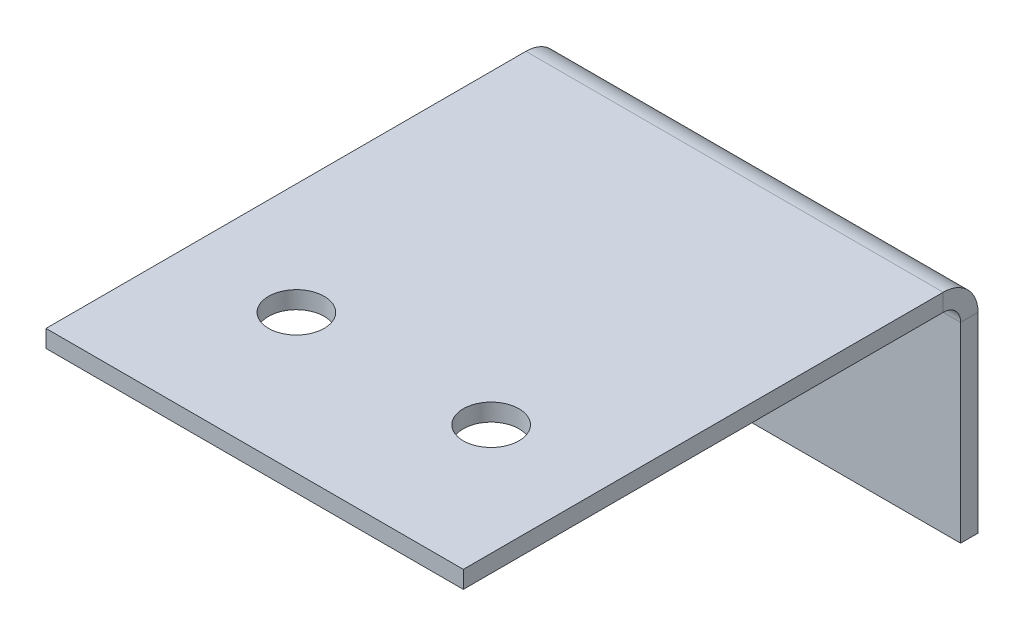
ISO-10303-21;
HEADER;
FILE_DESCRIPTION(('STEP AP214'),'2;1');
FILE_NAME('part.step','',(''),(''),'','','');
FILE_SCHEMA(('AUTOMOTIVE_DESIGN { 1 0 10303 214 1 1 1 1 }'));
ENDSEC;
DATA;
#1=APPLICATION_CONTEXT('core data for automotive mechanical design processes');
#2=APPLICATION_PROTOCOL_DEFINITION('international standard','automotive_design',2000,#1);
#3=PRODUCT_CONTEXT('',#1,'mechanical');
#4=PRODUCT('Part','Part','',(#3));
#5=PRODUCT_RELATED_PRODUCT_CATEGORY('part','',(#4));
#6=PRODUCT_DEFINITION_FORMATION('','',#4);
#7=PRODUCT_DEFINITION_CONTEXT('part definition',#1,'design');
#8=PRODUCT_DEFINITION('design','',#6,#7);
#9=PRODUCT_DEFINITION_SHAPE('','',#8);
#10=(LENGTH_UNIT() NAMED_UNIT(*) SI_UNIT(.MILLI.,.METRE.));
#11=(NAMED_UNIT(*) PLANE_ANGLE_UNIT() SI_UNIT($,.RADIAN.));
#12=(NAMED_UNIT(*) SI_UNIT($,.STERADIAN.) SOLID_ANGLE_UNIT());
#13=UNCERTAINTY_MEASURE_WITH_UNIT(LENGTH_MEASURE(1.E-05),#10,'distance_accuracy_value','');
#14=(GEOMETRIC_REPRESENTATION_CONTEXT(3) GLOBAL_UNCERTAINTY_ASSIGNED_CONTEXT((#13)) GLOBAL_UNIT_ASSIGNED_CONTEXT((#10,
#11,#12)) REPRESENTATION_CONTEXT('',''));
#15=CARTESIAN_POINT('',(0.,0.,0.));
#16=DIRECTION('',(0.,0.,1.));
#17=DIRECTION('',(1.,0.,0.));
#18=AXIS2_PLACEMENT_3D('',#15,#16,#17);
#19=CARTESIAN_POINT('',(19.05,1.5875,-23.495));
#20=DIRECTION('',(1.,0.,0.));
#21=DIRECTION('',(0.,0.,-1.));
#22=AXIS2_PLACEMENT_3D('',#19,#20,#21);
#23=PLANE('',#22);
#24=DIRECTION('',(0.,0.,1.));
#25=VECTOR('',#24,1.);
#26=CARTESIAN_POINT('',(19.05,0.,0.));
#27=LINE('',#26,#25);
#28=CARTESIAN_POINT('',(19.05,0.,23.495));
#29=VERTEX_POINT('',#28);
#30=CARTESIAN_POINT('',(19.05,0.,-20.32));
#31=VERTEX_POINT('',#30);
#32=EDGE_CURVE('E182',#29,#31,#27,.F.);
#33=ORIENTED_EDGE('',*,*,#32,.T.);
#34=DIRECTION('',(0.,1.,0.));
#35=VECTOR('',#34,1.);
#36=CARTESIAN_POINT('',(19.05,0.,-20.32));
#37=LINE('',#36,#35);
#38=CARTESIAN_POINT('',(19.05,1.58749999999999,-20.32));
#39=VERTEX_POINT('',#38);
#40=EDGE_CURVE('E141',#31,#39,#37,.T.);
#41=ORIENTED_EDGE('',*,*,#40,.T.);
#42=DIRECTION('',(0.,0.,-1.));
#43=VECTOR('',#42,1.);
#44=CARTESIAN_POINT('',(19.05,1.5875,-23.495));
#45=LINE('',#44,#43);
#46=CARTESIAN_POINT('',(19.05,1.5875,23.495));
#47=VERTEX_POINT('',#46);
#48=EDGE_CURVE('E184',#47,#39,#45,.T.);
#49=ORIENTED_EDGE('',*,*,#48,.F.);
#50=DIRECTION('',(0.,1.,0.));
#51=VECTOR('',#50,1.);
#52=CARTESIAN_POINT('',(19.05,1.5875,23.495));
#53=LINE('',#52,#51);
#54=EDGE_CURVE('E13',#29,#47,#53,.T.);
#55=ORIENTED_EDGE('',*,*,#54,.F.);
#56=EDGE_LOOP('',(#33,#41,#49,#55));
#57=FACE_BOUND('',#56,.T.);
#58=ADVANCED_FACE('F56',(#57),#23,.T.);
#59=CARTESIAN_POINT('',(0.,1.5875,0.));
#60=DIRECTION('',(0.,1.,0.));
#61=DIRECTION('',(0.,0.,1.));
#62=AXIS2_PLACEMENT_3D('',#59,#60,#61);
#63=PLANE('',#62);
#64=CARTESIAN_POINT('',(-8.89000000000001,1.5875,10.795));
#65=DIRECTION('',(0.,1.,0.));
#66=DIRECTION('',(0.,0.,1.));
#67=AXIS2_PLACEMENT_3D('',#64,#65,#66);
#68=CIRCLE('',#67,2.54);
#69=CARTESIAN_POINT('',(-8.89000000000001,1.5875,13.335));
#70=VERTEX_POINT('',#69);
#71=EDGE_CURVE('E201',#70,#70,#68,.T.);
#72=ORIENTED_EDGE('',*,*,#71,.F.);
#73=EDGE_LOOP('',(#72));
#74=FACE_BOUND('',#73,.T.);
#75=CARTESIAN_POINT('',(8.89,1.5875,10.795));
#76=DIRECTION('',(0.,1.,0.));
#77=DIRECTION('',(0.,0.,1.));
#78=AXIS2_PLACEMENT_3D('',#75,#76,#77);
#79=CIRCLE('',#78,2.54);
#80=CARTESIAN_POINT('',(8.89,1.5875,13.335));
#81=VERTEX_POINT('',#80);
#82=EDGE_CURVE('E193',#81,#81,#79,.T.);
#83=ORIENTED_EDGE('',*,*,#82,.F.);
#84=EDGE_LOOP('',(#83));
#85=FACE_BOUND('',#84,.T.);
#86=ORIENTED_EDGE('',*,*,#48,.T.);
#87=DIRECTION('',(1.,0.,0.));
#88=VECTOR('',#87,1.);
#89=CARTESIAN_POINT('',(19.05,1.58749999999999,-20.32));
#90=LINE('',#89,#88);
#91=CARTESIAN_POINT('',(-19.05,1.5875,-20.32));
#92=VERTEX_POINT('',#91);
#93=EDGE_CURVE('E100',#39,#92,#90,.F.);
#94=ORIENTED_EDGE('',*,*,#93,.T.);
#95=DIRECTION('',(0.,0.,1.));
#96=VECTOR('',#95,1.);
#97=CARTESIAN_POINT('',(-19.05,1.5875,-23.495));
#98=LINE('',#97,#96);
#99=CARTESIAN_POINT('',(-19.05,1.5875,23.495));
#100=VERTEX_POINT('',#99);
#101=EDGE_CURVE('E179',#92,#100,#98,.T.);
#102=ORIENTED_EDGE('',*,*,#101,.T.);
#103=DIRECTION('',(1.,0.,0.));
#104=VECTOR('',#103,1.);
#105=CARTESIAN_POINT('',(-19.05,1.5875,23.495));
#106=LINE('',#105,#104);
#107=EDGE_CURVE('E181',#100,#47,#106,.T.);
#108=ORIENTED_EDGE('',*,*,#107,.T.);
#109=EDGE_LOOP('',(#86,#94,#102,#108));
#110=FACE_BOUND('',#109,.T.);
#111=ADVANCED_FACE('F230',(#74,#85,#110),#63,.T.);
#112=CARTESIAN_POINT('',(0.,0.,0.));
#113=DIRECTION('',(0.,1.,0.));
#114=DIRECTION('',(0.,0.,1.));
#115=AXIS2_PLACEMENT_3D('',#112,#113,#114);
#116=PLANE('',#115);
#117=CARTESIAN_POINT('',(-8.89000000000001,0.,10.795));
#118=DIRECTION('',(0.,1.,0.));
#119=DIRECTION('',(0.,0.,1.));
#120=AXIS2_PLACEMENT_3D('',#117,#118,#119);
#121=CIRCLE('',#120,2.54);
#122=CARTESIAN_POINT('',(-8.89000000000001,0.,13.335));
#123=VERTEX_POINT('',#122);
#124=EDGE_CURVE('E60',#123,#123,#121,.T.);
#125=ORIENTED_EDGE('',*,*,#124,.T.);
#126=EDGE_LOOP('',(#125));
#127=FACE_BOUND('',#126,.T.);
#128=CARTESIAN_POINT('',(8.89,0.,10.795));
#129=DIRECTION('',(0.,1.,0.));
#130=DIRECTION('',(0.,0.,1.));
#131=AXIS2_PLACEMENT_3D('',#128,#129,#130);
#132=CIRCLE('',#131,2.54);
#133=CARTESIAN_POINT('',(8.89,0.,13.335));
#134=VERTEX_POINT('',#133);
#135=EDGE_CURVE('E169',#134,#134,#132,.T.);
#136=ORIENTED_EDGE('',*,*,#135,.T.);
#137=EDGE_LOOP('',(#136));
#138=FACE_BOUND('',#137,.T.);
#139=DIRECTION('',(1.,0.,0.));
#140=VECTOR('',#139,1.);
#141=CARTESIAN_POINT('',(19.05,0.,-20.32));
#142=LINE('',#141,#140);
#143=CARTESIAN_POINT('',(-19.05,0.,-20.32));
#144=VERTEX_POINT('',#143);
#145=EDGE_CURVE('E142',#31,#144,#142,.F.);
#146=ORIENTED_EDGE('',*,*,#145,.F.);
#147=ORIENTED_EDGE('',*,*,#32,.F.);
#148=DIRECTION('',(1.,0.,0.));
#149=VECTOR('',#148,1.);
#150=CARTESIAN_POINT('',(0.,0.,23.495));
#151=LINE('',#150,#149);
#152=CARTESIAN_POINT('',(-19.05,0.,23.495));
#153=VERTEX_POINT('',#152);
#154=EDGE_CURVE('E188',#153,#29,#151,.T.);
#155=ORIENTED_EDGE('',*,*,#154,.F.);
#156=DIRECTION('',(0.,0.,1.));
#157=VECTOR('',#156,1.);
#158=CARTESIAN_POINT('',(-19.05,0.,0.));
#159=LINE('',#158,#157);
#160=EDGE_CURVE('E94',#144,#153,#159,.T.);
#161=ORIENTED_EDGE('',*,*,#160,.F.);
#162=EDGE_LOOP('',(#146,#147,#155,#161));
#163=FACE_BOUND('',#162,.T.);
#164=ADVANCED_FACE('F234',(#127,#138,#163),#116,.F.);
#165=CARTESIAN_POINT('',(-19.05,1.5875,-23.495));
#166=DIRECTION('',(-1.,0.,0.));
#167=DIRECTION('',(0.,0.,1.));
#168=AXIS2_PLACEMENT_3D('',#165,#166,#167);
#169=PLANE('',#168);
#170=DIRECTION('',(0.,1.,0.));
#171=VECTOR('',#170,1.);
#172=CARTESIAN_POINT('',(-19.05,0.,-20.32));
#173=LINE('',#172,#171);
#174=EDGE_CURVE('E176',#144,#92,#173,.T.);
#175=ORIENTED_EDGE('',*,*,#174,.F.);
#176=ORIENTED_EDGE('',*,*,#160,.T.);
#177=DIRECTION('',(0.,1.,0.));
#178=VECTOR('',#177,1.);
#179=CARTESIAN_POINT('',(-19.05,1.5875,23.495));
#180=LINE('',#179,#178);
#181=EDGE_CURVE('E65',#153,#100,#180,.T.);
#182=ORIENTED_EDGE('',*,*,#181,.T.);
#183=ORIENTED_EDGE('',*,*,#101,.F.);
#184=EDGE_LOOP('',(#175,#176,#182,#183));
#185=FACE_BOUND('',#184,.T.);
#186=ADVANCED_FACE('F237',(#185),#169,.T.);
#187=CARTESIAN_POINT('',(-19.05,1.5875,23.495));
#188=DIRECTION('',(0.,0.,1.));
#189=DIRECTION('',(1.,0.,0.));
#190=AXIS2_PLACEMENT_3D('',#187,#188,#189);
#191=PLANE('',#190);
#192=ORIENTED_EDGE('',*,*,#154,.T.);
#193=ORIENTED_EDGE('',*,*,#54,.T.);
#194=ORIENTED_EDGE('',*,*,#107,.F.);
#195=ORIENTED_EDGE('',*,*,#181,.F.);
#196=EDGE_LOOP('',(#192,#193,#194,#195));
#197=FACE_BOUND('',#196,.T.);
#198=ADVANCED_FACE('F58',(#197),#191,.T.);
#199=CARTESIAN_POINT('',(-19.05,-1.58750000000001,-20.32));
#200=DIRECTION('',(-1.,0.,0.));
#201=DIRECTION('',(0.,0.,1.));
#202=AXIS2_PLACEMENT_3D('',#199,#200,#201);
#203=PLANE('',#202);
#204=DIRECTION('',(0.,0.,1.));
#205=VECTOR('',#204,1.);
#206=CARTESIAN_POINT('',(-19.05,-1.58749999999998,-23.495));
#207=LINE('',#206,#205);
#208=CARTESIAN_POINT('',(-19.05,-1.5875,-21.9075));
#209=VERTEX_POINT('',#208);
#210=CARTESIAN_POINT('',(-19.05,-1.5875,-23.495));
#211=VERTEX_POINT('',#210);
#212=EDGE_CURVE('E132',#209,#211,#207,.F.);
#213=ORIENTED_EDGE('',*,*,#212,.F.);
#214=CARTESIAN_POINT('',(-19.05,-1.58750000000001,-20.32));
#215=DIRECTION('',(1.,0.,0.));
#216=DIRECTION('',(0.,0.,-1.));
#217=AXIS2_PLACEMENT_3D('',#214,#215,#216);
#218=CIRCLE('',#217,1.5875);
#219=EDGE_CURVE('E126',#144,#209,#218,.F.);
#220=ORIENTED_EDGE('',*,*,#219,.F.);
#221=ORIENTED_EDGE('',*,*,#174,.T.);
#222=CARTESIAN_POINT('',(-19.05,-1.58750000000001,-20.32));
#223=DIRECTION('',(1.,0.,0.));
#224=DIRECTION('',(0.,0.,-1.));
#225=AXIS2_PLACEMENT_3D('',#222,#223,#224);
#226=CIRCLE('',#225,3.175);
#227=EDGE_CURVE('E73',#92,#211,#226,.F.);
#228=ORIENTED_EDGE('',*,*,#227,.T.);
#229=EDGE_LOOP('',(#213,#220,#221,#228));
#230=FACE_BOUND('',#229,.T.);
#231=ADVANCED_FACE('F236',(#230),#203,.T.);
#232=CARTESIAN_POINT('',(19.05,-1.58750000000001,-20.32));
#233=DIRECTION('',(-1.,0.,0.));
#234=DIRECTION('',(0.,0.,1.));
#235=AXIS2_PLACEMENT_3D('',#232,#233,#234);
#236=PLANE('',#235);
#237=CARTESIAN_POINT('',(19.05,-1.58750000000001,-20.32));
#238=DIRECTION('',(1.,0.,0.));
#239=DIRECTION('',(0.,0.,-1.));
#240=AXIS2_PLACEMENT_3D('',#237,#238,#239);
#241=CIRCLE('',#240,1.5875);
#242=CARTESIAN_POINT('',(19.05,-1.5875,-21.9075));
#243=VERTEX_POINT('',#242);
#244=EDGE_CURVE('E123',#243,#31,#241,.T.);
#245=ORIENTED_EDGE('',*,*,#244,.F.);
#246=DIRECTION('',(0.,0.,1.));
#247=VECTOR('',#246,1.);
#248=CARTESIAN_POINT('',(19.05,-1.5875,-21.9075));
#249=LINE('',#248,#247);
#250=CARTESIAN_POINT('',(19.05,-1.58749999999998,-23.495));
#251=VERTEX_POINT('',#250);
#252=EDGE_CURVE('E131',#243,#251,#249,.F.);
#253=ORIENTED_EDGE('',*,*,#252,.T.);
#254=CARTESIAN_POINT('',(19.05,-1.58750000000001,-20.32));
#255=DIRECTION('',(1.,0.,0.));
#256=DIRECTION('',(0.,0.,-1.));
#257=AXIS2_PLACEMENT_3D('',#254,#255,#256);
#258=CIRCLE('',#257,3.175);
#259=EDGE_CURVE('E171',#251,#39,#258,.T.);
#260=ORIENTED_EDGE('',*,*,#259,.T.);
#261=ORIENTED_EDGE('',*,*,#40,.F.);
#262=EDGE_LOOP('',(#245,#253,#260,#261));
#263=FACE_BOUND('',#262,.T.);
#264=ADVANCED_FACE('F137',(#263),#236,.F.);
#265=CARTESIAN_POINT('',(19.05,-1.58750000000001,-20.32));
#266=DIRECTION('',(1.,0.,0.));
#267=DIRECTION('',(0.,0.,-1.));
#268=AXIS2_PLACEMENT_3D('',#265,#266,#267);
#269=CYLINDRICAL_SURFACE('',#268,3.175);
#270=ORIENTED_EDGE('',*,*,#93,.F.);
#271=ORIENTED_EDGE('',*,*,#259,.F.);
#272=DIRECTION('',(1.,0.,0.));
#273=VECTOR('',#272,1.);
#274=CARTESIAN_POINT('',(-19.05,-1.58749999999998,-23.495));
#275=LINE('',#274,#273);
#276=EDGE_CURVE('E155',#251,#211,#275,.F.);
#277=ORIENTED_EDGE('',*,*,#276,.T.);
#278=ORIENTED_EDGE('',*,*,#227,.F.);
#279=EDGE_LOOP('',(#270,#271,#277,#278));
#280=FACE_BOUND('',#279,.T.);
#281=ADVANCED_FACE('F225',(#280),#269,.T.);
#282=CARTESIAN_POINT('',(19.05,-1.58750000000001,-20.32));
#283=DIRECTION('',(1.,0.,0.));
#284=DIRECTION('',(0.,0.,-1.));
#285=AXIS2_PLACEMENT_3D('',#282,#283,#284);
#286=CYLINDRICAL_SURFACE('',#285,1.5875);
#287=ORIENTED_EDGE('',*,*,#145,.T.);
#288=ORIENTED_EDGE('',*,*,#219,.T.);
#289=DIRECTION('',(1.,0.,0.));
#290=VECTOR('',#289,1.);
#291=CARTESIAN_POINT('',(-19.05,-1.5875,-21.9075));
#292=LINE('',#291,#290);
#293=EDGE_CURVE('E120',#209,#243,#292,.T.);
#294=ORIENTED_EDGE('',*,*,#293,.T.);
#295=ORIENTED_EDGE('',*,*,#244,.T.);
#296=EDGE_LOOP('',(#287,#288,#294,#295));
#297=FACE_BOUND('',#296,.T.);
#298=ADVANCED_FACE('F122',(#297),#286,.F.);
#299=CARTESIAN_POINT('',(19.05,-19.05,-23.4950000000001));
#300=DIRECTION('',(-1.,0.,0.));
#301=DIRECTION('',(0.,0.,1.));
#302=AXIS2_PLACEMENT_3D('',#299,#300,#301);
#303=PLANE('',#302);
#304=ORIENTED_EDGE('',*,*,#252,.F.);
#305=DIRECTION('',(0.,1.,0.));
#306=VECTOR('',#305,1.);
#307=CARTESIAN_POINT('',(19.05,-19.05,-21.9075000000001));
#308=LINE('',#307,#306);
#309=CARTESIAN_POINT('',(19.05,-19.05,-21.9075000000001));
#310=VERTEX_POINT('',#309);
#311=EDGE_CURVE('E151',#243,#310,#308,.F.);
#312=ORIENTED_EDGE('',*,*,#311,.T.);
#313=DIRECTION('',(0.,0.,1.));
#314=VECTOR('',#313,1.);
#315=CARTESIAN_POINT('',(19.05,-19.05,-23.4950000000001));
#316=LINE('',#315,#314);
#317=CARTESIAN_POINT('',(19.05,-19.05,-23.4950000000001));
#318=VERTEX_POINT('',#317);
#319=EDGE_CURVE('E143',#318,#310,#316,.T.);
#320=ORIENTED_EDGE('',*,*,#319,.F.);
#321=DIRECTION('',(0.,-1.,0.));
#322=VECTOR('',#321,1.);
#323=CARTESIAN_POINT('',(19.05,0.,-23.495));
#324=LINE('',#323,#322);
#325=EDGE_CURVE('E154',#251,#318,#324,.T.);
#326=ORIENTED_EDGE('',*,*,#325,.F.);
#327=EDGE_LOOP('',(#304,#312,#320,#326));
#328=FACE_BOUND('',#327,.T.);
#329=ADVANCED_FACE('F148',(#328),#303,.F.);
#330=CARTESIAN_POINT('',(-19.05,0.,-23.495));
#331=DIRECTION('',(1.,0.,0.));
#332=DIRECTION('',(0.,0.,-1.));
#333=AXIS2_PLACEMENT_3D('',#330,#331,#332);
#334=PLANE('',#333);
#335=ORIENTED_EDGE('',*,*,#212,.T.);
#336=DIRECTION('',(0.,1.,0.));
#337=VECTOR('',#336,1.);
#338=CARTESIAN_POINT('',(-19.05,0.,-23.495));
#339=LINE('',#338,#337);
#340=CARTESIAN_POINT('',(-19.05,-19.05,-23.4950000000001));
#341=VERTEX_POINT('',#340);
#342=EDGE_CURVE('E208',#341,#211,#339,.T.);
#343=ORIENTED_EDGE('',*,*,#342,.F.);
#344=DIRECTION('',(0.,0.,1.));
#345=VECTOR('',#344,1.);
#346=CARTESIAN_POINT('',(-19.05,-19.05,-23.4950000000001));
#347=LINE('',#346,#345);
#348=CARTESIAN_POINT('',(-19.05,-19.05,-21.9075000000001));
#349=VERTEX_POINT('',#348);
#350=EDGE_CURVE('E205',#341,#349,#347,.T.);
#351=ORIENTED_EDGE('',*,*,#350,.T.);
#352=DIRECTION('',(0.,-1.,0.));
#353=VECTOR('',#352,1.);
#354=CARTESIAN_POINT('',(-19.05,0.,-21.9075));
#355=LINE('',#354,#353);
#356=EDGE_CURVE('E162',#349,#209,#355,.F.);
#357=ORIENTED_EDGE('',*,*,#356,.T.);
#358=EDGE_LOOP('',(#335,#343,#351,#357));
#359=FACE_BOUND('',#358,.T.);
#360=ADVANCED_FACE('F215',(#359),#334,.F.);
#361=CARTESIAN_POINT('',(0.,0.,-23.495));
#362=DIRECTION('',(0.,0.,1.));
#363=DIRECTION('',(0.,-1.,0.));
#364=AXIS2_PLACEMENT_3D('',#361,#362,#363);
#365=PLANE('',#364);
#366=ORIENTED_EDGE('',*,*,#276,.F.);
#367=ORIENTED_EDGE('',*,*,#325,.T.);
#368=DIRECTION('',(-1.,0.,0.));
#369=VECTOR('',#368,1.);
#370=CARTESIAN_POINT('',(0.,-19.05,-23.4950000000001));
#371=LINE('',#370,#369);
#372=EDGE_CURVE('E211',#318,#341,#371,.T.);
#373=ORIENTED_EDGE('',*,*,#372,.T.);
#374=ORIENTED_EDGE('',*,*,#342,.T.);
#375=EDGE_LOOP('',(#366,#367,#373,#374));
#376=FACE_BOUND('',#375,.T.);
#377=ADVANCED_FACE('F273',(#376),#365,.F.);
#378=CARTESIAN_POINT('',(0.,0.,-21.9075));
#379=DIRECTION('',(0.,0.,1.));
#380=DIRECTION('',(0.,-1.,0.));
#381=AXIS2_PLACEMENT_3D('',#378,#379,#380);
#382=PLANE('',#381);
#383=ORIENTED_EDGE('',*,*,#311,.F.);
#384=ORIENTED_EDGE('',*,*,#293,.F.);
#385=ORIENTED_EDGE('',*,*,#356,.F.);
#386=DIRECTION('',(1.,0.,0.));
#387=VECTOR('',#386,1.);
#388=CARTESIAN_POINT('',(-19.05,-19.05,-21.9075000000001));
#389=LINE('',#388,#387);
#390=EDGE_CURVE('E159',#310,#349,#389,.F.);
#391=ORIENTED_EDGE('',*,*,#390,.F.);
#392=EDGE_LOOP('',(#383,#384,#385,#391));
#393=FACE_BOUND('',#392,.T.);
#394=ADVANCED_FACE('F157',(#393),#382,.T.);
#395=CARTESIAN_POINT('',(-19.05,-19.05,-23.4950000000001));
#396=DIRECTION('',(0.,1.,0.));
#397=DIRECTION('',(0.,0.,1.));
#398=AXIS2_PLACEMENT_3D('',#395,#396,#397);
#399=PLANE('',#398);
#400=ORIENTED_EDGE('',*,*,#390,.T.);
#401=ORIENTED_EDGE('',*,*,#350,.F.);
#402=ORIENTED_EDGE('',*,*,#372,.F.);
#403=ORIENTED_EDGE('',*,*,#319,.T.);
#404=EDGE_LOOP('',(#400,#401,#402,#403));
#405=FACE_BOUND('',#404,.T.);
#406=ADVANCED_FACE('F267',(#405),#399,.F.);
#407=CARTESIAN_POINT('',(8.89,-23.8125,10.795));
#408=DIRECTION('',(0.,1.,0.));
#409=DIRECTION('',(0.,0.,1.));
#410=AXIS2_PLACEMENT_3D('',#407,#408,#409);
#411=CYLINDRICAL_SURFACE('',#410,2.54);
#412=ORIENTED_EDGE('',*,*,#82,.T.);
#413=EDGE_LOOP('',(#412));
#414=FACE_BOUND('',#413,.T.);
#415=ORIENTED_EDGE('',*,*,#135,.F.);
#416=EDGE_LOOP('',(#415));
#417=FACE_BOUND('',#416,.T.);
#418=ADVANCED_FACE('F270',(#414,#417),#411,.F.);
#419=CARTESIAN_POINT('',(-8.89000000000001,-23.8125,10.795));
#420=DIRECTION('',(0.,1.,0.));
#421=DIRECTION('',(0.,0.,1.));
#422=AXIS2_PLACEMENT_3D('',#419,#420,#421);
#423=CYLINDRICAL_SURFACE('',#422,2.54);
#424=ORIENTED_EDGE('',*,*,#71,.T.);
#425=EDGE_LOOP('',(#424));
#426=FACE_BOUND('',#425,.T.);
#427=ORIENTED_EDGE('',*,*,#124,.F.);
#428=EDGE_LOOP('',(#427));
#429=FACE_BOUND('',#428,.T.);
#430=ADVANCED_FACE('F281',(#426,#429),#423,.F.);
#431=CLOSED_SHELL('',(#58,#111,#164,#186,#198,#231,#264,#281,#298,#329,#360,#377,#394,#406,#418,#430));
#432=MANIFOLD_SOLID_BREP('B2',#431);
#433=ADVANCED_BREP_SHAPE_REPRESENTATION('',(#18,#432),#14);
#434=SHAPE_DEFINITION_REPRESENTATION(#9,#433);
ENDSEC;
END-ISO-10303-21;
